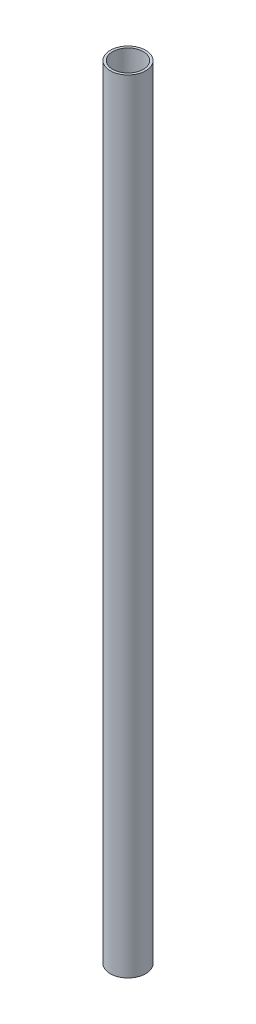
ISO-10303-21;
HEADER;
FILE_DESCRIPTION(('STEP AP214'),'2;1');
FILE_NAME('part.step','',(''),(''),'','','');
FILE_SCHEMA(('AUTOMOTIVE_DESIGN { 1 0 10303 214 1 1 1 1 }'));
ENDSEC;
DATA;
#1=APPLICATION_CONTEXT('core data for automotive mechanical design processes');
#2=APPLICATION_PROTOCOL_DEFINITION('international standard','automotive_design',2000,#1);
#3=PRODUCT_CONTEXT('',#1,'mechanical');
#4=PRODUCT('Part','Part','',(#3));
#5=PRODUCT_RELATED_PRODUCT_CATEGORY('part','',(#4));
#6=PRODUCT_DEFINITION_FORMATION('','',#4);
#7=PRODUCT_DEFINITION_CONTEXT('part definition',#1,'design');
#8=PRODUCT_DEFINITION('design','',#6,#7);
#9=PRODUCT_DEFINITION_SHAPE('','',#8);
#10=(LENGTH_UNIT() NAMED_UNIT(*) SI_UNIT(.MILLI.,.METRE.));
#11=(NAMED_UNIT(*) PLANE_ANGLE_UNIT() SI_UNIT($,.RADIAN.));
#12=(NAMED_UNIT(*) SI_UNIT($,.STERADIAN.) SOLID_ANGLE_UNIT());
#13=UNCERTAINTY_MEASURE_WITH_UNIT(LENGTH_MEASURE(1.E-05),#10,'distance_accuracy_value','');
#14=(GEOMETRIC_REPRESENTATION_CONTEXT(3) GLOBAL_UNCERTAINTY_ASSIGNED_CONTEXT((#13)) GLOBAL_UNIT_ASSIGNED_CONTEXT((#10,
#11,#12)) REPRESENTATION_CONTEXT('',''));
#15=CARTESIAN_POINT('',(0.,0.,0.));
#16=DIRECTION('',(0.,0.,1.));
#17=DIRECTION('',(1.,0.,0.));
#18=AXIS2_PLACEMENT_3D('',#15,#16,#17);
#19=CARTESIAN_POINT('',(0.,661.,0.));
#20=DIRECTION('',(0.,1.,0.));
#21=DIRECTION('',(0.,0.,1.));
#22=AXIS2_PLACEMENT_3D('',#19,#20,#21);
#23=PLANE('',#22);
#24=CARTESIAN_POINT('',(0.,661.,0.));
#25=DIRECTION('',(0.,1.,0.));
#26=DIRECTION('',(0.,0.,1.));
#27=AXIS2_PLACEMENT_3D('',#24,#25,#26);
#28=CIRCLE('',#27,15.);
#29=CARTESIAN_POINT('',(0.,661.,15.));
#30=VERTEX_POINT('',#29);
#31=EDGE_CURVE('E10',#30,#30,#28,.T.);
#32=ORIENTED_EDGE('',*,*,#31,.T.);
#33=EDGE_LOOP('',(#32));
#34=FACE_BOUND('',#33,.T.);
#35=CARTESIAN_POINT('',(0.,661.,0.));
#36=DIRECTION('',(0.,1.,0.));
#37=DIRECTION('',(0.,0.,1.));
#38=AXIS2_PLACEMENT_3D('',#35,#36,#37);
#39=CIRCLE('',#38,13.);
#40=CARTESIAN_POINT('',(0.,661.,13.));
#41=VERTEX_POINT('',#40);
#42=EDGE_CURVE('E41',#41,#41,#39,.T.);
#43=ORIENTED_EDGE('',*,*,#42,.F.);
#44=EDGE_LOOP('',(#43));
#45=FACE_BOUND('',#44,.T.);
#46=ADVANCED_FACE('F30',(#34,#45),#23,.T.);
#47=CARTESIAN_POINT('',(0.,0.,0.));
#48=DIRECTION('',(0.,1.,0.));
#49=DIRECTION('',(0.,0.,1.));
#50=AXIS2_PLACEMENT_3D('',#47,#48,#49);
#51=PLANE('',#50);
#52=CARTESIAN_POINT('',(0.,0.,0.));
#53=DIRECTION('',(0.,1.,0.));
#54=DIRECTION('',(0.,0.,1.));
#55=AXIS2_PLACEMENT_3D('',#52,#53,#54);
#56=CIRCLE('',#55,15.);
#57=CARTESIAN_POINT('',(0.,0.,15.));
#58=VERTEX_POINT('',#57);
#59=EDGE_CURVE('E34',#58,#58,#56,.T.);
#60=ORIENTED_EDGE('',*,*,#59,.F.);
#61=EDGE_LOOP('',(#60));
#62=FACE_BOUND('',#61,.T.);
#63=CARTESIAN_POINT('',(0.,0.,0.));
#64=DIRECTION('',(0.,1.,0.));
#65=DIRECTION('',(0.,0.,1.));
#66=AXIS2_PLACEMENT_3D('',#63,#64,#65);
#67=CIRCLE('',#66,13.);
#68=CARTESIAN_POINT('',(0.,0.,13.));
#69=VERTEX_POINT('',#68);
#70=EDGE_CURVE('E43',#69,#69,#67,.T.);
#71=ORIENTED_EDGE('',*,*,#70,.T.);
#72=EDGE_LOOP('',(#71));
#73=FACE_BOUND('',#72,.T.);
#74=ADVANCED_FACE('F53',(#62,#73),#51,.F.);
#75=CARTESIAN_POINT('',(0.,661.,0.));
#76=DIRECTION('',(0.,-1.,0.));
#77=DIRECTION('',(0.,0.,-1.));
#78=AXIS2_PLACEMENT_3D('',#75,#76,#77);
#79=CYLINDRICAL_SURFACE('',#78,15.);
#80=ORIENTED_EDGE('',*,*,#31,.F.);
#81=EDGE_LOOP('',(#80));
#82=FACE_BOUND('',#81,.T.);
#83=ORIENTED_EDGE('',*,*,#59,.T.);
#84=EDGE_LOOP('',(#83));
#85=FACE_BOUND('',#84,.T.);
#86=ADVANCED_FACE('F32',(#82,#85),#79,.T.);
#87=CARTESIAN_POINT('',(0.,661.,0.));
#88=DIRECTION('',(0.,-1.,0.));
#89=DIRECTION('',(0.,0.,-1.));
#90=AXIS2_PLACEMENT_3D('',#87,#88,#89);
#91=CYLINDRICAL_SURFACE('',#90,13.);
#92=ORIENTED_EDGE('',*,*,#42,.T.);
#93=EDGE_LOOP('',(#92));
#94=FACE_BOUND('',#93,.T.);
#95=ORIENTED_EDGE('',*,*,#70,.F.);
#96=EDGE_LOOP('',(#95));
#97=FACE_BOUND('',#96,.T.);
#98=ADVANCED_FACE('F49',(#94,#97),#91,.F.);
#99=CLOSED_SHELL('',(#46,#74,#86,#98));
#100=MANIFOLD_SOLID_BREP('B2',#99);
#101=ADVANCED_BREP_SHAPE_REPRESENTATION('',(#18,#100),#14);
#102=SHAPE_DEFINITION_REPRESENTATION(#9,#101);
ENDSEC;
END-ISO-10303-21;
